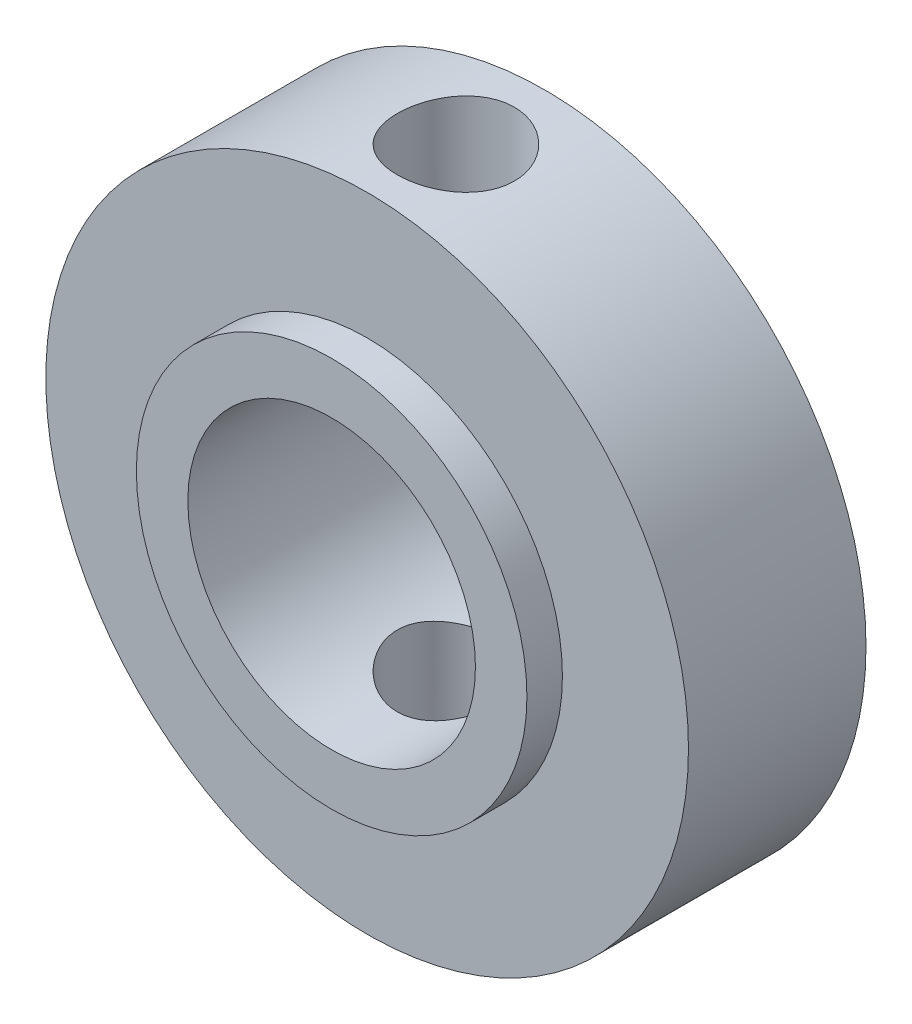
ISO-10303-21;
HEADER;
FILE_DESCRIPTION(('STEP AP214'),'2;1');
FILE_NAME('part.step','',(''),(''),'','','');
FILE_SCHEMA(('AUTOMOTIVE_DESIGN { 1 0 10303 214 1 1 1 1 }'));
ENDSEC;
DATA;
#1=APPLICATION_CONTEXT('core data for automotive mechanical design processes');
#2=APPLICATION_PROTOCOL_DEFINITION('international standard','automotive_design',2000,#1);
#3=PRODUCT_CONTEXT('',#1,'mechanical');
#4=PRODUCT('Part','Part','',(#3));
#5=PRODUCT_RELATED_PRODUCT_CATEGORY('part','',(#4));
#6=PRODUCT_DEFINITION_FORMATION('','',#4);
#7=PRODUCT_DEFINITION_CONTEXT('part definition',#1,'design');
#8=PRODUCT_DEFINITION('design','',#6,#7);
#9=PRODUCT_DEFINITION_SHAPE('','',#8);
#10=(LENGTH_UNIT() NAMED_UNIT(*) SI_UNIT(.MILLI.,.METRE.));
#11=(NAMED_UNIT(*) PLANE_ANGLE_UNIT() SI_UNIT($,.RADIAN.));
#12=(NAMED_UNIT(*) SI_UNIT($,.STERADIAN.) SOLID_ANGLE_UNIT());
#13=UNCERTAINTY_MEASURE_WITH_UNIT(LENGTH_MEASURE(1.E-05),#10,'distance_accuracy_value','');
#14=(GEOMETRIC_REPRESENTATION_CONTEXT(3) GLOBAL_UNCERTAINTY_ASSIGNED_CONTEXT((#13)) GLOBAL_UNIT_ASSIGNED_CONTEXT((#10,
#11,#12)) REPRESENTATION_CONTEXT('',''));
#15=CARTESIAN_POINT('',(0.,0.,0.));
#16=DIRECTION('',(0.,0.,1.));
#17=DIRECTION('',(1.,0.,0.));
#18=AXIS2_PLACEMENT_3D('',#15,#16,#17);
#19=CARTESIAN_POINT('',(0.,0.,5.));
#20=DIRECTION('',(0.,0.,1.));
#21=DIRECTION('',(1.,0.,0.));
#22=AXIS2_PLACEMENT_3D('',#19,#20,#21);
#23=PLANE('',#22);
#24=CARTESIAN_POINT('',(0.,0.,5.));
#25=DIRECTION('',(0.,0.,1.));
#26=DIRECTION('',(1.,0.,0.));
#27=AXIS2_PLACEMENT_3D('',#24,#25,#26);
#28=CIRCLE('',#27,9.05);
#29=CARTESIAN_POINT('',(9.05,0.,5.));
#30=VERTEX_POINT('',#29);
#31=EDGE_CURVE('E10',#30,#30,#28,.T.);
#32=ORIENTED_EDGE('',*,*,#31,.T.);
#33=EDGE_LOOP('',(#32));
#34=FACE_BOUND('',#33,.T.);
#35=CARTESIAN_POINT('',(0.,0.,5.));
#36=DIRECTION('',(0.,0.,1.));
#37=DIRECTION('',(1.,0.,0.));
#38=AXIS2_PLACEMENT_3D('',#35,#36,#37);
#39=CIRCLE('',#38,5.5);
#40=CARTESIAN_POINT('',(5.5,0.,5.));
#41=VERTEX_POINT('',#40);
#42=EDGE_CURVE('E80',#41,#41,#39,.T.);
#43=ORIENTED_EDGE('',*,*,#42,.F.);
#44=EDGE_LOOP('',(#43));
#45=FACE_BOUND('',#44,.T.);
#46=ADVANCED_FACE('F31',(#34,#45),#23,.T.);
#47=CARTESIAN_POINT('',(0.,0.,0.));
#48=DIRECTION('',(0.,0.,1.));
#49=DIRECTION('',(1.,0.,0.));
#50=AXIS2_PLACEMENT_3D('',#47,#48,#49);
#51=PLANE('',#50);
#52=CARTESIAN_POINT('',(0.,0.,0.));
#53=DIRECTION('',(0.,0.,1.));
#54=DIRECTION('',(1.,0.,0.));
#55=AXIS2_PLACEMENT_3D('',#52,#53,#54);
#56=CIRCLE('',#55,9.05);
#57=CARTESIAN_POINT('',(9.05,0.,0.));
#58=VERTEX_POINT('',#57);
#59=EDGE_CURVE('E44',#58,#58,#56,.T.);
#60=ORIENTED_EDGE('',*,*,#59,.F.);
#61=EDGE_LOOP('',(#60));
#62=FACE_BOUND('',#61,.T.);
#63=CARTESIAN_POINT('',(0.,0.,0.));
#64=DIRECTION('',(0.,0.,1.));
#65=DIRECTION('',(1.,0.,0.));
#66=AXIS2_PLACEMENT_3D('',#63,#64,#65);
#67=CIRCLE('',#66,4.05);
#68=CARTESIAN_POINT('',(4.05,0.,0.));
#69=VERTEX_POINT('',#68);
#70=EDGE_CURVE('E49',#69,#69,#67,.T.);
#71=ORIENTED_EDGE('',*,*,#70,.T.);
#72=EDGE_LOOP('',(#71));
#73=FACE_BOUND('',#72,.T.);
#74=ADVANCED_FACE('F90',(#62,#73),#51,.F.);
#75=CARTESIAN_POINT('',(0.,0.,5.));
#76=DIRECTION('',(0.,0.,-1.));
#77=DIRECTION('',(-1.,0.,0.));
#78=AXIS2_PLACEMENT_3D('',#75,#76,#77);
#79=CYLINDRICAL_SURFACE('',#78,9.05);
#80=CARTESIAN_POINT('',(0.,-9.05,4.15));
#81=CARTESIAN_POINT('',(0.0918653158786469,-9.04999835418691,4.14999644174235));
#82=CARTESIAN_POINT('',(0.183777466643054,-9.04858675602459,4.14230204294724));
#83=CARTESIAN_POINT('',(0.365014889983995,-9.04309163446092,4.11174573927217));
#84=CARTESIAN_POINT('',(0.454337859014321,-9.03900580369494,4.08887073612056));
#85=CARTESIAN_POINT('',(0.627749345455332,-9.02861958767951,4.02867433842091));
#86=CARTESIAN_POINT('',(0.711842399932922,-9.02232115436757,3.99136567418683));
#87=CARTESIAN_POINT('',(0.872566731464075,-9.00819874115789,3.90339644108385));
#88=CARTESIAN_POINT('',(0.949198675725378,-9.00037489785772,3.85273706760303));
#89=CARTESIAN_POINT('',(1.09370390442939,-8.98396689579707,3.73889367434314));
#90=CARTESIAN_POINT('',(1.16148023012444,-8.97537581633283,3.67558756621709));
#91=CARTESIAN_POINT('',(1.28551182898651,-8.95845338630628,3.53851041326618));
#92=CARTESIAN_POINT('',(1.34176630164015,-8.9501220538247,3.46473864191203));
#93=CARTESIAN_POINT('',(1.44155683965362,-8.93459523694386,3.3081439674417));
#94=CARTESIAN_POINT('',(1.48499498120575,-8.92740868161487,3.22525769893078));
#95=CARTESIAN_POINT('',(1.55729311483496,-8.91508226421303,3.05321136248132));
#96=CARTESIAN_POINT('',(1.58615429264757,-8.90994223567653,2.96405180550395));
#97=CARTESIAN_POINT('',(1.62816951256668,-8.9023603226341,2.78302484781796));
#98=CARTESIAN_POINT('',(1.64149222106259,-8.89988948680812,2.69119782981784));
#99=CARTESIAN_POINT('',(1.65257570254671,-8.89783836089094,2.50658112480002));
#100=CARTESIAN_POINT('',(1.65033779425475,-8.8982578258546,2.41379152002439));
#101=CARTESIAN_POINT('',(1.63050049406147,-8.90191352853218,2.23110087863407));
#102=CARTESIAN_POINT('',(1.61309228874326,-8.90511470773434,2.14117827743524));
#103=CARTESIAN_POINT('',(1.56370936670275,-8.91391812955002,1.96555175103254));
#104=CARTESIAN_POINT('',(1.53173406167989,-8.91952046913521,1.87984799636407));
#105=CARTESIAN_POINT('',(1.45393586062017,-8.93253193596062,1.71452922652112));
#106=CARTESIAN_POINT('',(1.40803520012452,-8.93995116333285,1.63495163464342));
#107=CARTESIAN_POINT('',(1.30374429084236,-8.95575368435939,1.48455587861372));
#108=CARTESIAN_POINT('',(1.24535284143453,-8.96413707065333,1.41373855753714));
#109=CARTESIAN_POINT('',(1.1167042545081,-8.98107641107084,1.28176841792529));
#110=CARTESIAN_POINT('',(1.04628345459342,-8.98963307657589,1.22077512164389));
#111=CARTESIAN_POINT('',(0.896124313350159,-9.00584002266863,1.11144451576352));
#112=CARTESIAN_POINT('',(0.816385888011003,-9.01349029508275,1.06310732028857));
#113=CARTESIAN_POINT('',(0.649692835744625,-9.02703666964821,0.980439875386929));
#114=CARTESIAN_POINT('',(0.562730129966506,-9.03293077318116,0.946125568421757));
#115=CARTESIAN_POINT('',(0.38414381569462,-9.04228512412056,0.892635792779184));
#116=CARTESIAN_POINT('',(0.292520675923408,-9.04574561577024,0.873458804859822));
#117=CARTESIAN_POINT('',(0.10858740876761,-9.04980947372506,0.85100856809369));
#118=CARTESIAN_POINT('',(0.0163048115530876,-9.05045212265051,0.847516642032323));
#119=CARTESIAN_POINT('',(-0.167525900441353,-9.04891615865532,0.855949999674511));
#120=CARTESIAN_POINT('',(-0.259074049066667,-9.0467376765003,0.867874568789659));
#121=CARTESIAN_POINT('',(-0.438148236926982,-9.03982864852683,0.906620583990148));
#122=CARTESIAN_POINT('',(-0.525698874643582,-9.03511696033809,0.933331997220688));
#123=CARTESIAN_POINT('',(-0.695079228218784,-9.02366762849749,1.0007748500813));
#124=CARTESIAN_POINT('',(-0.77690857197216,-9.01692985322246,1.04150720059557));
#125=CARTESIAN_POINT('',(-0.933461085248547,-9.0020777902554,1.13632403498202));
#126=CARTESIAN_POINT('',(-1.00810154422059,-8.99394992181383,1.19054291250166));
#127=CARTESIAN_POINT('',(-1.14730299030434,-8.97725569430974,1.31061109528579));
#128=CARTESIAN_POINT('',(-1.21186308999878,-8.96868929672967,1.37646142343042));
#129=CARTESIAN_POINT('',(-1.32989689368781,-8.95195402216226,1.51891094235317));
#130=CARTESIAN_POINT('',(-1.38322173602769,-8.94379146203602,1.59563434395578));
#131=CARTESIAN_POINT('',(-1.47622652783787,-8.92891274392728,1.75707830213374));
#132=CARTESIAN_POINT('',(-1.51590696677604,-8.92219653406285,1.84179857169718));
#133=CARTESIAN_POINT('',(-1.58028248775276,-8.91101996817504,2.01644354561749));
#134=CARTESIAN_POINT('',(-1.60504731436365,-8.90654912949815,2.10634183964275));
#135=CARTESIAN_POINT('',(-1.63910494942499,-8.90034493186519,2.28911197537168));
#136=CARTESIAN_POINT('',(-1.64839939792032,-8.89861128273533,2.38198350081325));
#137=CARTESIAN_POINT('',(-1.65119990778502,-8.89809190804028,2.56657397637695));
#138=CARTESIAN_POINT('',(-1.64494064133341,-8.89926236533958,2.65828932560411));
#139=CARTESIAN_POINT('',(-1.61732353349878,-8.90432245549193,2.83933749603207));
#140=CARTESIAN_POINT('',(-1.59596577088244,-8.90821207415951,2.9286703296596));
#141=CARTESIAN_POINT('',(-1.53885464155574,-8.91825423320689,3.10230057240163));
#142=CARTESIAN_POINT('',(-1.503125344772,-8.92440298842592,3.1866061316139));
#143=CARTESIAN_POINT('',(-1.41831059383867,-8.93827352059768,3.34806388399087));
#144=CARTESIAN_POINT('',(-1.36922426765,-8.94599540024656,3.42521560966285));
#145=CARTESIAN_POINT('',(-1.25826733569075,-8.96227889543574,3.5713538327889));
#146=CARTESIAN_POINT('',(-1.19622544418006,-8.97085085893853,3.64020914820864));
#147=CARTESIAN_POINT('',(-1.06147688879296,-8.98778996299903,3.76661036639546));
#148=CARTESIAN_POINT('',(-0.988767776775829,-8.99615705602297,3.82415366592784));
#149=CARTESIAN_POINT('',(-0.834014433287463,-9.01182632207426,3.92674903167555));
#150=CARTESIAN_POINT('',(-0.751896563971602,-9.01911890687873,3.9716915250949));
#151=CARTESIAN_POINT('',(-0.581171175992679,-9.03172402243457,4.04707153705437));
#152=CARTESIAN_POINT('',(-0.492569942655785,-9.037038441278,4.07752289466269));
#153=CARTESIAN_POINT('',(-0.336404615553172,-9.04398502294111,4.1167618196512));
#154=CARTESIAN_POINT('',(-0.269762232429034,-9.04622807983158,4.12920518880151));
#155=CARTESIAN_POINT('',(-0.135421701051178,-9.04923615793204,4.14582549503359));
#156=CARTESIAN_POINT('',(-0.0677235772343001,-9.05000121330176,4.1500026231656));
#157=CARTESIAN_POINT('',(0.,-9.05,4.15));
#158=B_SPLINE_CURVE_WITH_KNOTS('',3,(#80,#81,#82,#83,#84,#85,#86,#87,#88,#89,#90,#91,#92,#93,
#94,#95,#96,#97,#98,#99,#100,#101,#102,#103,#104,#105,#106,#107,#108,#109,#110,#111,#112,#113,
#114,#115,#116,#117,#118,#119,#120,#121,#122,#123,#124,#125,#126,#127,#128,#129,#130,#131,#132,
#133,#134,#135,#136,#137,#138,#139,#140,#141,#142,#143,#144,#145,#146,#147,#148,#149,#150,#151,
#152,#153,#154,#155,#156,#157),.UNSPECIFIED.,.T.,.F.,(4,2,2,2,2,2,2,2,2,2,2,2,2,2,2,2,2,2,2,2,2,
2,2,2,2,2,2,2,2,2,2,2,2,2,2,2,2,2,4),(0.,0.275348309997418,0.550934508038392,0.826278194502996,
1.10159723577509,1.37971513006499,1.65785234083341,1.93806268752813,2.21825023737021,
2.49536724703014,2.77246077206543,3.0461118654988,3.31977401146629,3.59499343511794,
3.87023932490475,4.14958167973901,4.4289265534041,4.70858813341622,4.98822164190213,
5.26394421986785,5.53965401794476,5.81333924021864,6.0870422460832,6.36359038587507,
6.64016285767571,6.92019671392109,7.20022052341865,7.47892458105018,7.75759909084044,
8.03209460376607,8.30658868469859,8.58062493536723,8.85467908130827,9.13261629758324,
9.41061740087658,9.69096581992249,9.9710459656007,10.1740388292267,10.3770270012053),.UNSPECIFIED.);
#159=CARTESIAN_POINT('',(0.,-9.05,4.15));
#160=VERTEX_POINT('',#159);
#161=EDGE_CURVE('E79',#160,#160,#158,.T.);
#162=ORIENTED_EDGE('',*,*,#161,.T.);
#163=EDGE_LOOP('',(#162));
#164=FACE_BOUND('',#163,.T.);
#165=CARTESIAN_POINT('',(0.,9.05,4.15));
#166=CARTESIAN_POINT('',(-0.0918653158786466,9.04999835418691,4.14999644174235));
#167=CARTESIAN_POINT('',(-0.183777466643053,9.04858675602459,4.14230204294724));
#168=CARTESIAN_POINT('',(-0.365014889983995,9.04309163446092,4.11174573927217));
#169=CARTESIAN_POINT('',(-0.454337859014321,9.03900580369494,4.08887073612056));
#170=CARTESIAN_POINT('',(-0.627749345455332,9.02861958767951,4.02867433842091));
#171=CARTESIAN_POINT('',(-0.711842399932921,9.02232115436757,3.99136567418683));
#172=CARTESIAN_POINT('',(-0.872566731464074,9.00819874115789,3.90339644108385));
#173=CARTESIAN_POINT('',(-0.949198675725377,9.00037489785772,3.85273706760303));
#174=CARTESIAN_POINT('',(-1.09370390442939,8.98396689579707,3.73889367434314));
#175=CARTESIAN_POINT('',(-1.16148023012444,8.97537581633283,3.67558756621709));
#176=CARTESIAN_POINT('',(-1.28551182898651,8.95845338630628,3.53851041326618));
#177=CARTESIAN_POINT('',(-1.34176630164015,8.9501220538247,3.46473864191203));
#178=CARTESIAN_POINT('',(-1.44155683965361,8.93459523694386,3.3081439674417));
#179=CARTESIAN_POINT('',(-1.48499498120575,8.92740868161487,3.22525769893078));
#180=CARTESIAN_POINT('',(-1.55729311483496,8.91508226421303,3.05321136248132));
#181=CARTESIAN_POINT('',(-1.58615429264757,8.90994223567653,2.96405180550395));
#182=CARTESIAN_POINT('',(-1.62816951256668,8.9023603226341,2.78302484781796));
#183=CARTESIAN_POINT('',(-1.64149222106259,8.89988948680812,2.69119782981784));
#184=CARTESIAN_POINT('',(-1.65257570254671,8.89783836089094,2.50658112480002));
#185=CARTESIAN_POINT('',(-1.65033779425475,8.8982578258546,2.41379152002439));
#186=CARTESIAN_POINT('',(-1.63050049406147,8.90191352853218,2.23110087863407));
#187=CARTESIAN_POINT('',(-1.61309228874326,8.90511470773434,2.14117827743524));
#188=CARTESIAN_POINT('',(-1.56370936670275,8.91391812955002,1.96555175103254));
#189=CARTESIAN_POINT('',(-1.53173406167989,8.91952046913521,1.87984799636407));
#190=CARTESIAN_POINT('',(-1.45393586062017,8.93253193596062,1.71452922652112));
#191=CARTESIAN_POINT('',(-1.40803520012452,8.93995116333285,1.63495163464342));
#192=CARTESIAN_POINT('',(-1.30374429084236,8.95575368435939,1.48455587861372));
#193=CARTESIAN_POINT('',(-1.24535284143453,8.96413707065333,1.41373855753714));
#194=CARTESIAN_POINT('',(-1.1167042545081,8.98107641107084,1.28176841792529));
#195=CARTESIAN_POINT('',(-1.04628345459342,8.98963307657589,1.22077512164389));
#196=CARTESIAN_POINT('',(-0.896124313350158,9.00584002266863,1.11144451576352));
#197=CARTESIAN_POINT('',(-0.816385888011003,9.01349029508275,1.06310732028857));
#198=CARTESIAN_POINT('',(-0.649692835744624,9.02703666964821,0.980439875386929));
#199=CARTESIAN_POINT('',(-0.562730129966505,9.03293077318116,0.946125568421757));
#200=CARTESIAN_POINT('',(-0.38414381569462,9.04228512412056,0.892635792779185));
#201=CARTESIAN_POINT('',(-0.292520675923407,9.04574561577024,0.873458804859822));
#202=CARTESIAN_POINT('',(-0.10858740876761,9.04980947372506,0.85100856809369));
#203=CARTESIAN_POINT('',(-0.0163048115530871,9.05045212265051,0.847516642032323));
#204=CARTESIAN_POINT('',(0.167525900441354,9.04891615865532,0.855949999674511));
#205=CARTESIAN_POINT('',(0.259074049066667,9.0467376765003,0.867874568789659));
#206=CARTESIAN_POINT('',(0.438148236926983,9.03982864852684,0.906620583990148));
#207=CARTESIAN_POINT('',(0.525698874643582,9.03511696033809,0.933331997220688));
#208=CARTESIAN_POINT('',(0.695079228218784,9.02366762849749,1.0007748500813));
#209=CARTESIAN_POINT('',(0.77690857197216,9.01692985322246,1.04150720059557));
#210=CARTESIAN_POINT('',(0.933461085248548,9.0020777902554,1.13632403498202));
#211=CARTESIAN_POINT('',(1.00810154422059,8.99394992181383,1.19054291250166));
#212=CARTESIAN_POINT('',(1.14730299030434,8.97725569430975,1.3106110952858));
#213=CARTESIAN_POINT('',(1.21186308999878,8.96868929672967,1.37646142343042));
#214=CARTESIAN_POINT('',(1.32989689368781,8.95195402216226,1.51891094235317));
#215=CARTESIAN_POINT('',(1.38322173602769,8.94379146203602,1.59563434395578));
#216=CARTESIAN_POINT('',(1.47622652783787,8.92891274392728,1.75707830213374));
#217=CARTESIAN_POINT('',(1.51590696677604,8.92219653406285,1.84179857169718));
#218=CARTESIAN_POINT('',(1.58028248775276,8.91101996817504,2.01644354561749));
#219=CARTESIAN_POINT('',(1.60504731436365,8.90654912949815,2.10634183964275));
#220=CARTESIAN_POINT('',(1.63910494942499,8.90034493186519,2.28911197537168));
#221=CARTESIAN_POINT('',(1.64839939792032,8.89861128273533,2.38198350081325));
#222=CARTESIAN_POINT('',(1.65119990778502,8.89809190804028,2.56657397637695));
#223=CARTESIAN_POINT('',(1.64494064133341,8.89926236533958,2.65828932560411));
#224=CARTESIAN_POINT('',(1.61732353349878,8.90432245549193,2.83933749603207));
#225=CARTESIAN_POINT('',(1.59596577088244,8.90821207415951,2.9286703296596));
#226=CARTESIAN_POINT('',(1.53885464155574,8.91825423320689,3.10230057240163));
#227=CARTESIAN_POINT('',(1.503125344772,8.92440298842592,3.1866061316139));
#228=CARTESIAN_POINT('',(1.41831059383867,8.93827352059768,3.34806388399087));
#229=CARTESIAN_POINT('',(1.36922426765,8.94599540024656,3.42521560966285));
#230=CARTESIAN_POINT('',(1.25826733569075,8.96227889543574,3.5713538327889));
#231=CARTESIAN_POINT('',(1.19622544418007,8.97085085893853,3.64020914820864));
#232=CARTESIAN_POINT('',(1.06147688879296,8.98778996299903,3.76661036639546));
#233=CARTESIAN_POINT('',(0.98876777677583,8.99615705602297,3.82415366592784));
#234=CARTESIAN_POINT('',(0.834014433287463,9.01182632207426,3.92674903167555));
#235=CARTESIAN_POINT('',(0.751896563971602,9.01911890687873,3.9716915250949));
#236=CARTESIAN_POINT('',(0.581171175992679,9.03172402243457,4.04707153705437));
#237=CARTESIAN_POINT('',(0.492569942655785,9.037038441278,4.07752289466269));
#238=CARTESIAN_POINT('',(0.336404615553172,9.04398502294111,4.1167618196512));
#239=CARTESIAN_POINT('',(0.269762232429033,9.04622807983158,4.12920518880151));
#240=CARTESIAN_POINT('',(0.135421701051177,9.04923615793204,4.14582549503359));
#241=CARTESIAN_POINT('',(0.0677235772343,9.05000121330176,4.1500026231656));
#242=CARTESIAN_POINT('',(0.,9.05,4.15));
#243=B_SPLINE_CURVE_WITH_KNOTS('',3,(#165,#166,#167,#168,#169,#170,#171,#172,#173,#174,#175,
#176,#177,#178,#179,#180,#181,#182,#183,#184,#185,#186,#187,#188,#189,#190,#191,#192,#193,#194,
#195,#196,#197,#198,#199,#200,#201,#202,#203,#204,#205,#206,#207,#208,#209,#210,#211,#212,#213,
#214,#215,#216,#217,#218,#219,#220,#221,#222,#223,#224,#225,#226,#227,#228,#229,#230,#231,#232,
#233,#234,#235,#236,#237,#238,#239,#240,#241,#242),.UNSPECIFIED.,.T.,.F.,(4,2,2,2,2,2,2,2,2,2,2,
2,2,2,2,2,2,2,2,2,2,2,2,2,2,2,2,2,2,2,2,2,2,2,2,2,2,2,4),(0.,0.275348309997418,
0.550934508038392,0.826278194502996,1.10159723577509,1.37971513006499,1.65785234083341,
1.93806268752813,2.21825023737021,2.49536724703014,2.77246077206543,3.0461118654988,
3.31977401146629,3.59499343511794,3.87023932490475,4.14958167973901,4.4289265534041,
4.70858813341622,4.98822164190213,5.26394421986785,5.53965401794476,5.81333924021864,
6.0870422460832,6.36359038587507,6.64016285767571,6.92019671392109,7.20022052341865,
7.47892458105018,7.75759909084044,8.03209460376607,8.30658868469859,8.58062493536723,
8.85467908130827,9.13261629758324,9.41061740087658,9.69096581992249,9.9710459656007,
10.1740388292267,10.3770270012053),.UNSPECIFIED.);
#244=CARTESIAN_POINT('',(0.,9.05,4.15));
#245=VERTEX_POINT('',#244);
#246=EDGE_CURVE('E74',#245,#245,#243,.T.);
#247=ORIENTED_EDGE('',*,*,#246,.T.);
#248=EDGE_LOOP('',(#247));
#249=FACE_BOUND('',#248,.T.);
#250=ORIENTED_EDGE('',*,*,#31,.F.);
#251=EDGE_LOOP('',(#250));
#252=FACE_BOUND('',#251,.T.);
#253=ORIENTED_EDGE('',*,*,#59,.T.);
#254=EDGE_LOOP('',(#253));
#255=FACE_BOUND('',#254,.T.);
#256=ADVANCED_FACE('F33',(#164,#249,#252,#255),#79,.T.);
#257=CARTESIAN_POINT('',(0.,0.,5.));
#258=DIRECTION('',(0.,0.,-1.));
#259=DIRECTION('',(-1.,0.,0.));
#260=AXIS2_PLACEMENT_3D('',#257,#258,#259);
#261=CYLINDRICAL_SURFACE('',#260,4.05);
#262=CARTESIAN_POINT('',(0.,-4.05,4.15));
#263=CARTESIAN_POINT('',(0.0885507077909313,-4.04999343496065,4.14999118964999));
#264=CARTESIAN_POINT('',(0.177248927358013,-4.0470619459948,4.1428291643101));
#265=CARTESIAN_POINT('',(0.352139131253219,-4.03562006615083,4.11443171868207));
#266=CARTESIAN_POINT('',(0.438323776526134,-4.02709477234193,4.09315870244133));
#267=CARTESIAN_POINT('',(0.605373065696627,-4.0053828650125,4.03744779081831));
#268=CARTESIAN_POINT('',(0.686254360846377,-3.99221176025166,4.00305366586323));
#269=CARTESIAN_POINT('',(0.841023439909997,-3.96249895184923,3.92225358554275));
#270=CARTESIAN_POINT('',(0.914913503861033,-3.94595835268189,3.87585156485773));
#271=CARTESIAN_POINT('',(1.05729645634823,-3.91027472249942,3.76997582299722));
#272=CARTESIAN_POINT('',(1.12540595487094,-3.89104893250371,3.71001462453748));
#273=CARTESIAN_POINT('',(1.25092897652607,-3.85253113761938,3.57975224112155));
#274=CARTESIAN_POINT('',(1.30833709391486,-3.83323910425225,3.50944586226717));
#275=CARTESIAN_POINT('',(1.41346369879523,-3.79577180354529,3.35651712007593));
#276=CARTESIAN_POINT('',(1.46060667392953,-3.77769033768848,3.27347377082207));
#277=CARTESIAN_POINT('',(1.54008404773546,-3.74599593853055,3.09979066240022));
#278=CARTESIAN_POINT('',(1.57242574242323,-3.73238080457352,3.0091546720068));
#279=CARTESIAN_POINT('',(1.61981746676573,-3.7120522891706,2.82726845302006));
#280=CARTESIAN_POINT('',(1.63560328009539,-3.70504676375834,2.73624381162206));
#281=CARTESIAN_POINT('',(1.65173237797912,-3.69788672659509,2.55258880633698));
#282=CARTESIAN_POINT('',(1.65208365362755,-3.6977286696289,2.45995929820847));
#283=CARTESIAN_POINT('',(1.63788979415855,-3.70403307423587,2.2829061811839));
#284=CARTESIAN_POINT('',(1.62442542609953,-3.71001521299486,2.19837545483439));
#285=CARTESIAN_POINT('',(1.58478928513293,-3.72711736315561,2.03289771574045));
#286=CARTESIAN_POINT('',(1.55861520170599,-3.73823830873142,1.95195135752474));
#287=CARTESIAN_POINT('',(1.49379850792552,-3.76461253188123,1.79394585922022));
#288=CARTESIAN_POINT('',(1.45490777022014,-3.77994698476034,1.71700266145104));
#289=CARTESIAN_POINT('',(1.36593644623418,-3.81299960423474,1.57044429964074));
#290=CARTESIAN_POINT('',(1.31585156142171,-3.83071868548023,1.50083196578526));
#291=CARTESIAN_POINT('',(1.20117965862929,-3.86827959305622,1.365016983385));
#292=CARTESIAN_POINT('',(1.13575005019823,-3.88817750671503,1.29953931013629));
#293=CARTESIAN_POINT('',(0.994633177440062,-3.92664605506927,1.18024893211559));
#294=CARTESIAN_POINT('',(0.918943721096589,-3.94521640483215,1.12643872650194));
#295=CARTESIAN_POINT('',(0.757334938420499,-3.97943452879814,1.03101074976616));
#296=CARTESIAN_POINT('',(0.671232852809589,-3.99501204891112,0.989675444638086));
#297=CARTESIAN_POINT('',(0.492501029397025,-4.02095473458863,0.922327880533085));
#298=CARTESIAN_POINT('',(0.399874764805964,-4.03132264997968,0.896307536494518));
#299=CARTESIAN_POINT('',(0.216792764969082,-4.04517126834939,0.861817200321308));
#300=CARTESIAN_POINT('',(0.1265492476224,-4.04903348631927,0.852373524779974));
#301=CARTESIAN_POINT('',(-0.0543075530294579,-4.0506443555359,0.848417306268469));
#302=CARTESIAN_POINT('',(-0.144920729357623,-4.04839466536081,0.853900712562192));
#303=CARTESIAN_POINT('',(-0.319467165596771,-4.03828329047316,0.878935191787102));
#304=CARTESIAN_POINT('',(-0.403514249852021,-4.03069023510639,0.897813231885886));
#305=CARTESIAN_POINT('',(-0.567164345763661,-4.01093790016658,0.948176136417794));
#306=CARTESIAN_POINT('',(-0.646766788870266,-3.99877803794667,0.979662609506458));
#307=CARTESIAN_POINT('',(-0.80203335476521,-3.97059986606492,1.05537783570259));
#308=CARTESIAN_POINT('',(-0.877500368414425,-3.95447414792198,1.09996954175683));
#309=CARTESIAN_POINT('',(-1.02014812820659,-3.92010077333803,1.20022857875038));
#310=CARTESIAN_POINT('',(-1.08732546964748,-3.90185225096538,1.25590043612066));
#311=CARTESIAN_POINT('',(-1.21631383455707,-3.8636655061736,1.38120280308803));
#312=CARTESIAN_POINT('',(-1.27744302099462,-3.84369711212032,1.45152783277085));
#313=CARTESIAN_POINT('',(-1.3872099415236,-3.80546131190097,1.60177635389871));
#314=CARTESIAN_POINT('',(-1.4358452872439,-3.78719423138941,1.68170167629372));
#315=CARTESIAN_POINT('',(-1.51964368512233,-3.75436299729723,1.85027721385774));
#316=CARTESIAN_POINT('',(-1.55464356757076,-3.73984435369032,1.9390180461355));
#317=CARTESIAN_POINT('',(-1.60892065790667,-3.71682121242864,2.12190718849774));
#318=CARTESIAN_POINT('',(-1.62821006413223,-3.70831204941956,2.21605124235234));
#319=CARTESIAN_POINT('',(-1.64933235512858,-3.69896253968255,2.39954567463997));
#320=CARTESIAN_POINT('',(-1.65235450525243,-3.69759993090142,2.48873329977238));
#321=CARTESIAN_POINT('',(-1.64400243763539,-3.70132099751837,2.6662857504901));
#322=CARTESIAN_POINT('',(-1.6326302076409,-3.70640378286033,2.75465068798455));
#323=CARTESIAN_POINT('',(-1.5967959690617,-3.72197479599772,2.92418659947029));
#324=CARTESIAN_POINT('',(-1.5729116218825,-3.73222377751303,3.00550368930202));
#325=CARTESIAN_POINT('',(-1.51328214179866,-3.75679538737239,3.16300307387066));
#326=CARTESIAN_POINT('',(-1.47753370725118,-3.77111914952366,3.23918393214346));
#327=CARTESIAN_POINT('',(-1.39277496465012,-3.80326756076631,3.38911341719341));
#328=CARTESIAN_POINT('',(-1.34311053053165,-3.82124812217269,3.46245823995794));
#329=CARTESIAN_POINT('',(-1.23286792296735,-3.85822679510571,3.60014569929337));
#330=CARTESIAN_POINT('',(-1.17228623850897,-3.87722523259834,3.66448542794404));
#331=CARTESIAN_POINT('',(-1.03700786816778,-3.91565870813011,3.78685204318633));
#332=CARTESIAN_POINT('',(-0.96162963678133,-3.93503490420199,3.84414737192488));
#333=CARTESIAN_POINT('',(-0.801600406026374,-3.97072374426096,3.94530056828767));
#334=CARTESIAN_POINT('',(-0.71694516475866,-3.98703497746665,3.98915225373113));
#335=CARTESIAN_POINT('',(-0.542219494047556,-4.01449654820316,4.06117675296375));
#336=CARTESIAN_POINT('',(-0.452272119479741,-4.02573349594322,4.08961449260012));
#337=CARTESIAN_POINT('',(-0.268486854779753,-4.04213529708416,4.13071263040838));
#338=CARTESIAN_POINT('',(-0.174662215787274,-4.04731930538543,4.1434228070969));
#339=CARTESIAN_POINT('',(-0.0537209482055284,-4.04973472037408,4.14934683371726));
#340=CARTESIAN_POINT('',(-0.0268672639422336,-4.05000199190554,4.15000267315762));
#341=CARTESIAN_POINT('',(0.,-4.05,4.15));
#342=B_SPLINE_CURVE_WITH_KNOTS('',3,(#262,#263,#264,#265,#266,#267,#268,#269,#270,#271,#272,
#273,#274,#275,#276,#277,#278,#279,#280,#281,#282,#283,#284,#285,#286,#287,#288,#289,#290,#291,
#292,#293,#294,#295,#296,#297,#298,#299,#300,#301,#302,#303,#304,#305,#306,#307,#308,#309,#310,
#311,#312,#313,#314,#315,#316,#317,#318,#319,#320,#321,#322,#323,#324,#325,#326,#327,#328,#329,
#330,#331,#332,#333,#334,#335,#336,#337,#338,#339,#340,#341),.UNSPECIFIED.,.T.,.F.,(4,2,2,2,2,2,
2,2,2,2,2,2,2,2,2,2,2,2,2,2,2,2,2,2,2,2,2,2,2,2,2,2,2,2,2,2,2,2,2,4),(0.,0.265578240242927,
0.531866918739049,0.797274950057757,1.06259612382966,1.33965517291133,1.6168537998139,
1.90695717131185,2.19691738731029,2.47336090756097,2.74966129995493,3.00588108257749,
3.26214746124956,3.52374656654219,3.78544629852623,4.0682019410634,4.35101808983702,
4.63982607043941,4.92848144669788,5.19953017743196,5.47050536147859,5.7287495494761,
5.98702669623797,6.2532673882285,6.5196170681629,6.80419398803943,7.0888252683307,
7.37676503029237,7.66448100883867,7.93084467673054,8.19717156598691,8.45216431603517,
8.70722808730107,8.9772312575831,9.24732141696985,9.53586325848503,9.82453759022358,
10.1080789187628,10.3907205102875,10.4712998851556),.UNSPECIFIED.);
#343=CARTESIAN_POINT('',(0.,-4.05,4.15));
#344=VERTEX_POINT('',#343);
#345=EDGE_CURVE('E36',#344,#344,#342,.T.);
#346=ORIENTED_EDGE('',*,*,#345,.F.);
#347=EDGE_LOOP('',(#346));
#348=FACE_BOUND('',#347,.T.);
#349=CARTESIAN_POINT('',(0.,4.05,4.15));
#350=CARTESIAN_POINT('',(-0.0885507077909308,4.04999343496065,4.14999118964999));
#351=CARTESIAN_POINT('',(-0.177248927358012,4.0470619459948,4.1428291643101));
#352=CARTESIAN_POINT('',(-0.352139131253219,4.03562006615083,4.11443171868207));
#353=CARTESIAN_POINT('',(-0.438323776526133,4.02709477234193,4.09315870244133));
#354=CARTESIAN_POINT('',(-0.605373065696626,4.0053828650125,4.03744779081831));
#355=CARTESIAN_POINT('',(-0.686254360846376,3.99221176025166,4.00305366586323));
#356=CARTESIAN_POINT('',(-0.841023439909996,3.96249895184923,3.92225358554275));
#357=CARTESIAN_POINT('',(-0.914913503861032,3.94595835268189,3.87585156485773));
#358=CARTESIAN_POINT('',(-1.05729645634823,3.91027472249942,3.76997582299722));
#359=CARTESIAN_POINT('',(-1.12540595487094,3.89104893250371,3.71001462453748));
#360=CARTESIAN_POINT('',(-1.25092897652607,3.85253113761938,3.57975224112155));
#361=CARTESIAN_POINT('',(-1.30833709391486,3.83323910425225,3.50944586226717));
#362=CARTESIAN_POINT('',(-1.41346369879523,3.79577180354529,3.35651712007593));
#363=CARTESIAN_POINT('',(-1.46060667392953,3.77769033768848,3.27347377082207));
#364=CARTESIAN_POINT('',(-1.54008404773546,3.74599593853055,3.09979066240022));
#365=CARTESIAN_POINT('',(-1.57242574242323,3.73238080457352,3.0091546720068));
#366=CARTESIAN_POINT('',(-1.61981746676573,3.7120522891706,2.82726845302006));
#367=CARTESIAN_POINT('',(-1.63560328009539,3.70504676375835,2.73624381162206));
#368=CARTESIAN_POINT('',(-1.65173237797912,3.69788672659509,2.55258880633698));
#369=CARTESIAN_POINT('',(-1.65208365362755,3.6977286696289,2.45995929820847));
#370=CARTESIAN_POINT('',(-1.63788979415855,3.70403307423586,2.2829061811839));
#371=CARTESIAN_POINT('',(-1.62442542609953,3.71001521299486,2.19837545483439));
#372=CARTESIAN_POINT('',(-1.58478928513293,3.72711736315561,2.03289771574045));
#373=CARTESIAN_POINT('',(-1.55861520170599,3.73823830873142,1.95195135752474));
#374=CARTESIAN_POINT('',(-1.49379850792552,3.76461253188123,1.79394585922022));
#375=CARTESIAN_POINT('',(-1.45490777022014,3.77994698476034,1.71700266145104));
#376=CARTESIAN_POINT('',(-1.36593644623418,3.81299960423474,1.57044429964074));
#377=CARTESIAN_POINT('',(-1.31585156142171,3.83071868548023,1.50083196578526));
#378=CARTESIAN_POINT('',(-1.20117965862929,3.86827959305622,1.36501698338501));
#379=CARTESIAN_POINT('',(-1.13575005019823,3.88817750671503,1.29953931013629));
#380=CARTESIAN_POINT('',(-0.994633177440062,3.92664605506927,1.18024893211559));
#381=CARTESIAN_POINT('',(-0.918943721096589,3.94521640483215,1.12643872650194));
#382=CARTESIAN_POINT('',(-0.757334938420499,3.97943452879814,1.03101074976616));
#383=CARTESIAN_POINT('',(-0.671232852809589,3.99501204891112,0.989675444638086));
#384=CARTESIAN_POINT('',(-0.492501029397024,4.02095473458863,0.922327880533085));
#385=CARTESIAN_POINT('',(-0.399874764805963,4.03132264997968,0.896307536494518));
#386=CARTESIAN_POINT('',(-0.216792764969082,4.04517126834939,0.861817200321309));
#387=CARTESIAN_POINT('',(-0.1265492476224,4.04903348631927,0.852373524779974));
#388=CARTESIAN_POINT('',(0.0543075530294576,4.0506443555359,0.848417306268469));
#389=CARTESIAN_POINT('',(0.144920729357622,4.04839466536081,0.853900712562192));
#390=CARTESIAN_POINT('',(0.31946716559677,4.03828329047316,0.878935191787102));
#391=CARTESIAN_POINT('',(0.40351424985202,4.03069023510639,0.897813231885886));
#392=CARTESIAN_POINT('',(0.567164345763661,4.01093790016658,0.948176136417794));
#393=CARTESIAN_POINT('',(0.646766788870265,3.99877803794667,0.979662609506458));
#394=CARTESIAN_POINT('',(0.80203335476521,3.97059986606492,1.05537783570259));
#395=CARTESIAN_POINT('',(0.877500368414425,3.95447414792198,1.09996954175683));
#396=CARTESIAN_POINT('',(1.02014812820659,3.92010077333803,1.20022857875037));
#397=CARTESIAN_POINT('',(1.08732546964748,3.90185225096538,1.25590043612066));
#398=CARTESIAN_POINT('',(1.21631383455707,3.8636655061736,1.38120280308803));
#399=CARTESIAN_POINT('',(1.27744302099462,3.84369711212032,1.45152783277085));
#400=CARTESIAN_POINT('',(1.3872099415236,3.80546131190097,1.60177635389871));
#401=CARTESIAN_POINT('',(1.4358452872439,3.78719423138941,1.68170167629372));
#402=CARTESIAN_POINT('',(1.51964368512233,3.75436299729723,1.85027721385774));
#403=CARTESIAN_POINT('',(1.55464356757076,3.73984435369031,1.93901804613549));
#404=CARTESIAN_POINT('',(1.60892065790667,3.71682121242864,2.12190718849774));
#405=CARTESIAN_POINT('',(1.62821006413223,3.70831204941956,2.21605124235233));
#406=CARTESIAN_POINT('',(1.64933235512858,3.69896253968255,2.39954567463997));
#407=CARTESIAN_POINT('',(1.65235450525243,3.69759993090142,2.48873329977238));
#408=CARTESIAN_POINT('',(1.64400243763539,3.70132099751837,2.6662857504901));
#409=CARTESIAN_POINT('',(1.6326302076409,3.70640378286033,2.75465068798455));
#410=CARTESIAN_POINT('',(1.5967959690617,3.72197479599772,2.92418659947029));
#411=CARTESIAN_POINT('',(1.5729116218825,3.73222377751303,3.00550368930202));
#412=CARTESIAN_POINT('',(1.51328214179866,3.75679538737239,3.16300307387065));
#413=CARTESIAN_POINT('',(1.47753370725118,3.77111914952366,3.23918393214346));
#414=CARTESIAN_POINT('',(1.39277496465012,3.80326756076631,3.38911341719341));
#415=CARTESIAN_POINT('',(1.34311053053165,3.82124812217269,3.46245823995794));
#416=CARTESIAN_POINT('',(1.23286792296735,3.85822679510571,3.60014569929337));
#417=CARTESIAN_POINT('',(1.17228623850897,3.87722523259834,3.66448542794404));
#418=CARTESIAN_POINT('',(1.03700786816779,3.9156587081301,3.78685204318633));
#419=CARTESIAN_POINT('',(0.961629636781332,3.93503490420199,3.84414737192488));
#420=CARTESIAN_POINT('',(0.801600406026376,3.97072374426096,3.94530056828767));
#421=CARTESIAN_POINT('',(0.716945164758661,3.98703497746665,3.98915225373113));
#422=CARTESIAN_POINT('',(0.542219494047557,4.01449654820316,4.06117675296375));
#423=CARTESIAN_POINT('',(0.452272119479742,4.02573349594322,4.08961449260012));
#424=CARTESIAN_POINT('',(0.268486854779754,4.04213529708416,4.13071263040838));
#425=CARTESIAN_POINT('',(0.174662215787275,4.04731930538543,4.1434228070969));
#426=CARTESIAN_POINT('',(0.0537209482055298,4.04973472037408,4.14934683371726));
#427=CARTESIAN_POINT('',(0.0268672639422346,4.05000199190554,4.15000267315762));
#428=CARTESIAN_POINT('',(0.,4.05,4.15));
#429=B_SPLINE_CURVE_WITH_KNOTS('',3,(#349,#350,#351,#352,#353,#354,#355,#356,#357,#358,#359,
#360,#361,#362,#363,#364,#365,#366,#367,#368,#369,#370,#371,#372,#373,#374,#375,#376,#377,#378,
#379,#380,#381,#382,#383,#384,#385,#386,#387,#388,#389,#390,#391,#392,#393,#394,#395,#396,#397,
#398,#399,#400,#401,#402,#403,#404,#405,#406,#407,#408,#409,#410,#411,#412,#413,#414,#415,#416,
#417,#418,#419,#420,#421,#422,#423,#424,#425,#426,#427,#428),.UNSPECIFIED.,.T.,.F.,(4,2,2,2,2,2,
2,2,2,2,2,2,2,2,2,2,2,2,2,2,2,2,2,2,2,2,2,2,2,2,2,2,2,2,2,2,2,2,2,4),(0.,0.265578240242927,
0.531866918739049,0.797274950057757,1.06259612382966,1.33965517291133,1.6168537998139,
1.90695717131185,2.19691738731029,2.47336090756097,2.74966129995493,3.00588108257749,
3.26214746124956,3.52374656654219,3.78544629852623,4.0682019410634,4.35101808983701,
4.63982607043941,4.92848144669788,5.19953017743196,5.47050536147858,5.7287495494761,
5.98702669623797,6.25326738822849,6.5196170681629,6.80419398803943,7.0888252683307,
7.37676503029237,7.66448100883867,7.93084467673054,8.19717156598691,8.45216431603517,
8.70722808730107,8.97723125758309,9.24732141696985,9.53586325848503,9.82453759022357,
10.1080789187628,10.3907205102875,10.4712998851556),.UNSPECIFIED.);
#430=CARTESIAN_POINT('',(0.,4.05,4.15));
#431=VERTEX_POINT('',#430);
#432=EDGE_CURVE('E53',#431,#431,#429,.T.);
#433=ORIENTED_EDGE('',*,*,#432,.F.);
#434=EDGE_LOOP('',(#433));
#435=FACE_BOUND('',#434,.T.);
#436=ORIENTED_EDGE('',*,*,#70,.F.);
#437=EDGE_LOOP('',(#436));
#438=FACE_BOUND('',#437,.T.);
#439=CARTESIAN_POINT('',(0.,0.,6.));
#440=DIRECTION('',(0.,0.,1.));
#441=DIRECTION('',(1.,0.,0.));
#442=AXIS2_PLACEMENT_3D('',#439,#440,#441);
#443=CIRCLE('',#442,4.05);
#444=CARTESIAN_POINT('',(4.05,0.,6.));
#445=VERTEX_POINT('',#444);
#446=EDGE_CURVE('E97',#445,#445,#443,.T.);
#447=ORIENTED_EDGE('',*,*,#446,.T.);
#448=EDGE_LOOP('',(#447));
#449=FACE_BOUND('',#448,.T.);
#450=ADVANCED_FACE('F58',(#348,#435,#438,#449),#261,.F.);
#451=CARTESIAN_POINT('',(0.,-9.05,2.5));
#452=DIRECTION('',(0.,1.,0.));
#453=DIRECTION('',(0.,0.,1.));
#454=AXIS2_PLACEMENT_3D('',#451,#452,#453);
#455=CYLINDRICAL_SURFACE('',#454,1.65);
#456=ORIENTED_EDGE('',*,*,#432,.T.);
#457=EDGE_LOOP('',(#456));
#458=FACE_BOUND('',#457,.T.);
#459=ORIENTED_EDGE('',*,*,#246,.F.);
#460=EDGE_LOOP('',(#459));
#461=FACE_BOUND('',#460,.T.);
#462=ADVANCED_FACE('F66',(#458,#461),#455,.F.);
#463=ORIENTED_EDGE('',*,*,#345,.T.);
#464=EDGE_LOOP('',(#463));
#465=FACE_BOUND('',#464,.T.);
#466=ORIENTED_EDGE('',*,*,#161,.F.);
#467=EDGE_LOOP('',(#466));
#468=FACE_BOUND('',#467,.T.);
#469=ADVANCED_FACE('F61',(#465,#468),#455,.F.);
#470=CARTESIAN_POINT('',(0.,0.,6.));
#471=DIRECTION('',(0.,0.,1.));
#472=DIRECTION('',(1.,0.,0.));
#473=AXIS2_PLACEMENT_3D('',#470,#471,#472);
#474=PLANE('',#473);
#475=CARTESIAN_POINT('',(0.,0.,6.));
#476=DIRECTION('',(0.,0.,1.));
#477=DIRECTION('',(1.,0.,0.));
#478=AXIS2_PLACEMENT_3D('',#475,#476,#477);
#479=CIRCLE('',#478,5.5);
#480=CARTESIAN_POINT('',(5.5,0.,6.));
#481=VERTEX_POINT('',#480);
#482=EDGE_CURVE('E57',#481,#481,#479,.T.);
#483=ORIENTED_EDGE('',*,*,#482,.T.);
#484=EDGE_LOOP('',(#483));
#485=FACE_BOUND('',#484,.T.);
#486=ORIENTED_EDGE('',*,*,#446,.F.);
#487=EDGE_LOOP('',(#486));
#488=FACE_BOUND('',#487,.T.);
#489=ADVANCED_FACE('F65',(#485,#488),#474,.T.);
#490=CARTESIAN_POINT('',(0.,0.,6.));
#491=DIRECTION('',(0.,0.,-1.));
#492=DIRECTION('',(-1.,0.,0.));
#493=AXIS2_PLACEMENT_3D('',#490,#491,#492);
#494=CYLINDRICAL_SURFACE('',#493,5.5);
#495=ORIENTED_EDGE('',*,*,#482,.F.);
#496=EDGE_LOOP('',(#495));
#497=FACE_BOUND('',#496,.T.);
#498=ORIENTED_EDGE('',*,*,#42,.T.);
#499=EDGE_LOOP('',(#498));
#500=FACE_BOUND('',#499,.T.);
#501=ADVANCED_FACE('F68',(#497,#500),#494,.T.);
#502=CLOSED_SHELL('',(#46,#74,#256,#450,#462,#469,#489,#501));
#503=MANIFOLD_SOLID_BREP('B2',#502);
#504=ADVANCED_BREP_SHAPE_REPRESENTATION('',(#18,#503),#14);
#505=SHAPE_DEFINITION_REPRESENTATION(#9,#504);
ENDSEC;
END-ISO-10303-21;
